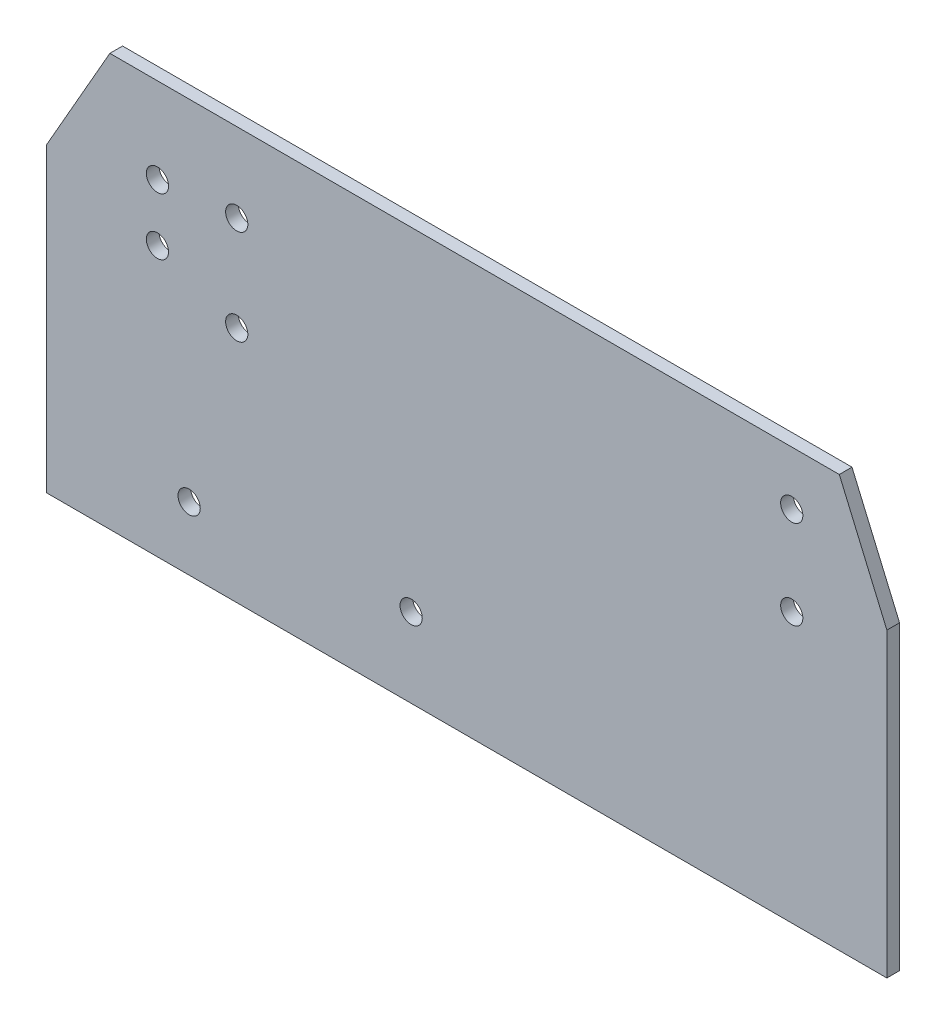
ISO-10303-21;
HEADER;
FILE_DESCRIPTION(('STEP AP214'),'2;1');
FILE_NAME('part.step','',(''),(''),'','','');
FILE_SCHEMA(('AUTOMOTIVE_DESIGN { 1 0 10303 214 1 1 1 1 }'));
ENDSEC;
DATA;
#1=APPLICATION_CONTEXT('core data for automotive mechanical design processes');
#2=APPLICATION_PROTOCOL_DEFINITION('international standard','automotive_design',2000,#1);
#3=PRODUCT_CONTEXT('',#1,'mechanical');
#4=PRODUCT('Part','Part','',(#3));
#5=PRODUCT_RELATED_PRODUCT_CATEGORY('part','',(#4));
#6=PRODUCT_DEFINITION_FORMATION('','',#4);
#7=PRODUCT_DEFINITION_CONTEXT('part definition',#1,'design');
#8=PRODUCT_DEFINITION('design','',#6,#7);
#9=PRODUCT_DEFINITION_SHAPE('','',#8);
#10=(LENGTH_UNIT() NAMED_UNIT(*) SI_UNIT(.MILLI.,.METRE.));
#11=(NAMED_UNIT(*) PLANE_ANGLE_UNIT() SI_UNIT($,.RADIAN.));
#12=(NAMED_UNIT(*) SI_UNIT($,.STERADIAN.) SOLID_ANGLE_UNIT());
#13=UNCERTAINTY_MEASURE_WITH_UNIT(LENGTH_MEASURE(1.E-05),#10,'distance_accuracy_value','');
#14=(GEOMETRIC_REPRESENTATION_CONTEXT(3) GLOBAL_UNCERTAINTY_ASSIGNED_CONTEXT((#13)) GLOBAL_UNIT_ASSIGNED_CONTEXT((#10,
#11,#12)) REPRESENTATION_CONTEXT('',''));
#15=CARTESIAN_POINT('',(0.,0.,0.));
#16=DIRECTION('',(0.,0.,1.));
#17=DIRECTION('',(1.,0.,0.));
#18=AXIS2_PLACEMENT_3D('',#15,#16,#17);
#19=CARTESIAN_POINT('',(0.,0.,2.));
#20=DIRECTION('',(0.,0.,1.));
#21=DIRECTION('',(1.,0.,0.));
#22=AXIS2_PLACEMENT_3D('',#19,#20,#21);
#23=PLANE('',#22);
#24=CARTESIAN_POINT('',(120.,88.,2.));
#25=DIRECTION('',(0.,0.,1.));
#26=DIRECTION('',(1.,0.,0.));
#27=AXIS2_PLACEMENT_3D('',#24,#25,#26);
#28=CIRCLE('',#27,3.50000000000001);
#29=CARTESIAN_POINT('',(123.5,88.,2.));
#30=VERTEX_POINT('',#29);
#31=EDGE_CURVE('E213',#30,#30,#28,.T.);
#32=ORIENTED_EDGE('',*,*,#31,.F.);
#33=EDGE_LOOP('',(#32));
#34=FACE_BOUND('',#33,.T.);
#35=CARTESIAN_POINT('',(-55.,50.,2.));
#36=DIRECTION('',(0.,0.,1.));
#37=DIRECTION('',(1.,0.,0.));
#38=AXIS2_PLACEMENT_3D('',#35,#36,#37);
#39=CIRCLE('',#38,3.5);
#40=CARTESIAN_POINT('',(-51.5,50.,2.));
#41=VERTEX_POINT('',#40);
#42=EDGE_CURVE('E223',#41,#41,#39,.T.);
#43=ORIENTED_EDGE('',*,*,#42,.F.);
#44=EDGE_LOOP('',(#43));
#45=FACE_BOUND('',#44,.T.);
#46=CARTESIAN_POINT('',(120.,60.,2.));
#47=DIRECTION('',(0.,0.,1.));
#48=DIRECTION('',(1.,0.,0.));
#49=AXIS2_PLACEMENT_3D('',#46,#47,#48);
#50=CIRCLE('',#49,3.50000000000001);
#51=CARTESIAN_POINT('',(123.5,60.,2.));
#52=VERTEX_POINT('',#51);
#53=EDGE_CURVE('E240',#52,#52,#50,.T.);
#54=ORIENTED_EDGE('',*,*,#53,.F.);
#55=EDGE_LOOP('',(#54));
#56=FACE_BOUND('',#55,.T.);
#57=CARTESIAN_POINT('',(0.,0.,2.));
#58=DIRECTION('',(0.,0.,1.));
#59=DIRECTION('',(1.,0.,0.));
#60=AXIS2_PLACEMENT_3D('',#57,#58,#59);
#61=CIRCLE('',#60,3.5);
#62=CARTESIAN_POINT('',(3.5,0.,2.));
#63=VERTEX_POINT('',#62);
#64=EDGE_CURVE('E128',#63,#63,#61,.T.);
#65=ORIENTED_EDGE('',*,*,#64,.F.);
#66=EDGE_LOOP('',(#65));
#67=FACE_BOUND('',#66,.T.);
#68=DIRECTION('',(0.,-1.,0.));
#69=VECTOR('',#68,1.);
#70=CARTESIAN_POINT('',(-115.,70.,2.));
#71=LINE('',#70,#69);
#72=CARTESIAN_POINT('',(-115.,70.,2.));
#73=VERTEX_POINT('',#72);
#74=CARTESIAN_POINT('',(-115.,-25.,2.));
#75=VERTEX_POINT('',#74);
#76=EDGE_CURVE('E140',#73,#75,#71,.T.);
#77=ORIENTED_EDGE('',*,*,#76,.T.);
#78=DIRECTION('',(1.,0.,0.));
#79=VECTOR('',#78,1.);
#80=CARTESIAN_POINT('',(-115.,-25.,2.));
#81=LINE('',#80,#79);
#82=CARTESIAN_POINT('',(150.,-25.,2.));
#83=VERTEX_POINT('',#82);
#84=EDGE_CURVE('E92',#75,#83,#81,.T.);
#85=ORIENTED_EDGE('',*,*,#84,.T.);
#86=DIRECTION('',(0.,1.,0.));
#87=VECTOR('',#86,1.);
#88=CARTESIAN_POINT('',(150.,-25.,2.));
#89=LINE('',#88,#87);
#90=CARTESIAN_POINT('',(150.,70.,2.));
#91=VERTEX_POINT('',#90);
#92=EDGE_CURVE('E107',#83,#91,#89,.T.);
#93=ORIENTED_EDGE('',*,*,#92,.T.);
#94=DIRECTION('',(-0.393919298579167,0.919145030018058,0.));
#95=VECTOR('',#94,1.);
#96=CARTESIAN_POINT('',(150.,70.,2.));
#97=LINE('',#96,#95);
#98=CARTESIAN_POINT('',(135.,105.,2.));
#99=VERTEX_POINT('',#98);
#100=EDGE_CURVE('E105',#91,#99,#97,.T.);
#101=ORIENTED_EDGE('',*,*,#100,.T.);
#102=DIRECTION('',(-1.,0.,0.));
#103=VECTOR('',#102,1.);
#104=CARTESIAN_POINT('',(135.,105.,2.));
#105=LINE('',#104,#103);
#106=CARTESIAN_POINT('',(-95.,105.,2.));
#107=VERTEX_POINT('',#106);
#108=EDGE_CURVE('E106',#99,#107,#105,.T.);
#109=ORIENTED_EDGE('',*,*,#108,.T.);
#110=DIRECTION('',(-0.496138938356834,-0.868243142124459,0.));
#111=VECTOR('',#110,1.);
#112=CARTESIAN_POINT('',(-95.,105.,2.));
#113=LINE('',#112,#111);
#114=EDGE_CURVE('E59',#107,#73,#113,.T.);
#115=ORIENTED_EDGE('',*,*,#114,.T.);
#116=EDGE_LOOP('',(#77,#85,#93,#101,#109,#115));
#117=FACE_BOUND('',#116,.T.);
#118=CARTESIAN_POINT('',(-80.,60.,2.));
#119=DIRECTION('',(0.,0.,1.));
#120=DIRECTION('',(1.,0.,0.));
#121=AXIS2_PLACEMENT_3D('',#118,#119,#120);
#122=CIRCLE('',#121,3.50000000000001);
#123=CARTESIAN_POINT('',(-76.5,60.,2.));
#124=VERTEX_POINT('',#123);
#125=EDGE_CURVE('E242',#124,#124,#122,.T.);
#126=ORIENTED_EDGE('',*,*,#125,.F.);
#127=EDGE_LOOP('',(#126));
#128=FACE_BOUND('',#127,.T.);
#129=CARTESIAN_POINT('',(-70.,-5.,2.));
#130=DIRECTION('',(0.,0.,1.));
#131=DIRECTION('',(1.,0.,0.));
#132=AXIS2_PLACEMENT_3D('',#129,#130,#131);
#133=CIRCLE('',#132,3.50000000000001);
#134=CARTESIAN_POINT('',(-66.5,-5.,2.));
#135=VERTEX_POINT('',#134);
#136=EDGE_CURVE('E232',#135,#135,#133,.T.);
#137=ORIENTED_EDGE('',*,*,#136,.F.);
#138=EDGE_LOOP('',(#137));
#139=FACE_BOUND('',#138,.T.);
#140=CARTESIAN_POINT('',(-55.,80.,2.));
#141=DIRECTION('',(0.,0.,1.));
#142=DIRECTION('',(1.,0.,0.));
#143=AXIS2_PLACEMENT_3D('',#140,#141,#142);
#144=CIRCLE('',#143,3.5);
#145=CARTESIAN_POINT('',(-51.5,80.,2.));
#146=VERTEX_POINT('',#145);
#147=EDGE_CURVE('E218',#146,#146,#144,.T.);
#148=ORIENTED_EDGE('',*,*,#147,.F.);
#149=EDGE_LOOP('',(#148));
#150=FACE_BOUND('',#149,.T.);
#151=CARTESIAN_POINT('',(-80.,78.,2.));
#152=DIRECTION('',(0.,0.,1.));
#153=DIRECTION('',(1.,0.,0.));
#154=AXIS2_PLACEMENT_3D('',#151,#152,#153);
#155=CIRCLE('',#154,3.50000000000001);
#156=CARTESIAN_POINT('',(-76.5,78.,2.));
#157=VERTEX_POINT('',#156);
#158=EDGE_CURVE('E204',#157,#157,#155,.T.);
#159=ORIENTED_EDGE('',*,*,#158,.F.);
#160=EDGE_LOOP('',(#159));
#161=FACE_BOUND('',#160,.T.);
#162=ADVANCED_FACE('F41',(#34,#45,#56,#67,#117,#128,#139,#150,#161),#23,.T.);
#163=CARTESIAN_POINT('',(0.,0.,-2.));
#164=DIRECTION('',(0.,0.,1.));
#165=DIRECTION('',(1.,0.,0.));
#166=AXIS2_PLACEMENT_3D('',#163,#164,#165);
#167=PLANE('',#166);
#168=DIRECTION('',(0.,-1.,0.));
#169=VECTOR('',#168,1.);
#170=CARTESIAN_POINT('',(-115.,70.,-2.));
#171=LINE('',#170,#169);
#172=CARTESIAN_POINT('',(-115.,70.,-2.));
#173=VERTEX_POINT('',#172);
#174=CARTESIAN_POINT('',(-115.,-25.,-2.));
#175=VERTEX_POINT('',#174);
#176=EDGE_CURVE('E127',#173,#175,#171,.T.);
#177=ORIENTED_EDGE('',*,*,#176,.F.);
#178=DIRECTION('',(-0.496138938356834,-0.868243142124459,0.));
#179=VECTOR('',#178,1.);
#180=CARTESIAN_POINT('',(-95.,105.,-2.));
#181=LINE('',#180,#179);
#182=CARTESIAN_POINT('',(-95.,105.,-2.));
#183=VERTEX_POINT('',#182);
#184=EDGE_CURVE('E87',#183,#173,#181,.T.);
#185=ORIENTED_EDGE('',*,*,#184,.F.);
#186=DIRECTION('',(-1.,0.,0.));
#187=VECTOR('',#186,1.);
#188=CARTESIAN_POINT('',(135.,105.,-2.));
#189=LINE('',#188,#187);
#190=CARTESIAN_POINT('',(135.,105.,-2.));
#191=VERTEX_POINT('',#190);
#192=EDGE_CURVE('E82',#191,#183,#189,.T.);
#193=ORIENTED_EDGE('',*,*,#192,.F.);
#194=DIRECTION('',(-0.393919298579167,0.919145030018058,0.));
#195=VECTOR('',#194,1.);
#196=CARTESIAN_POINT('',(150.,70.,-2.));
#197=LINE('',#196,#195);
#198=CARTESIAN_POINT('',(150.,70.,-2.));
#199=VERTEX_POINT('',#198);
#200=EDGE_CURVE('E118',#199,#191,#197,.T.);
#201=ORIENTED_EDGE('',*,*,#200,.F.);
#202=DIRECTION('',(0.,1.,0.));
#203=VECTOR('',#202,1.);
#204=CARTESIAN_POINT('',(150.,-25.,-2.));
#205=LINE('',#204,#203);
#206=CARTESIAN_POINT('',(150.,-25.,-2.));
#207=VERTEX_POINT('',#206);
#208=EDGE_CURVE('E134',#207,#199,#205,.T.);
#209=ORIENTED_EDGE('',*,*,#208,.F.);
#210=DIRECTION('',(1.,0.,0.));
#211=VECTOR('',#210,1.);
#212=CARTESIAN_POINT('',(-115.,-25.,-2.));
#213=LINE('',#212,#211);
#214=EDGE_CURVE('E129',#175,#207,#213,.T.);
#215=ORIENTED_EDGE('',*,*,#214,.F.);
#216=EDGE_LOOP('',(#177,#185,#193,#201,#209,#215));
#217=FACE_BOUND('',#216,.T.);
#218=CARTESIAN_POINT('',(0.,0.,-2.));
#219=DIRECTION('',(0.,0.,1.));
#220=DIRECTION('',(1.,0.,0.));
#221=AXIS2_PLACEMENT_3D('',#218,#219,#220);
#222=CIRCLE('',#221,3.5);
#223=CARTESIAN_POINT('',(3.5,0.,-2.));
#224=VERTEX_POINT('',#223);
#225=EDGE_CURVE('E247',#224,#224,#222,.T.);
#226=ORIENTED_EDGE('',*,*,#225,.T.);
#227=EDGE_LOOP('',(#226));
#228=FACE_BOUND('',#227,.T.);
#229=CARTESIAN_POINT('',(-80.,60.,-2.));
#230=DIRECTION('',(0.,0.,1.));
#231=DIRECTION('',(1.,0.,0.));
#232=AXIS2_PLACEMENT_3D('',#229,#230,#231);
#233=CIRCLE('',#232,3.50000000000001);
#234=CARTESIAN_POINT('',(-76.5,60.,-2.));
#235=VERTEX_POINT('',#234);
#236=EDGE_CURVE('E238',#235,#235,#233,.T.);
#237=ORIENTED_EDGE('',*,*,#236,.T.);
#238=EDGE_LOOP('',(#237));
#239=FACE_BOUND('',#238,.T.);
#240=CARTESIAN_POINT('',(120.,60.,-2.));
#241=DIRECTION('',(0.,0.,1.));
#242=DIRECTION('',(1.,0.,0.));
#243=AXIS2_PLACEMENT_3D('',#240,#241,#242);
#244=CIRCLE('',#243,3.50000000000001);
#245=CARTESIAN_POINT('',(123.5,60.,-2.));
#246=VERTEX_POINT('',#245);
#247=EDGE_CURVE('E231',#246,#246,#244,.T.);
#248=ORIENTED_EDGE('',*,*,#247,.T.);
#249=EDGE_LOOP('',(#248));
#250=FACE_BOUND('',#249,.T.);
#251=CARTESIAN_POINT('',(-70.,-5.,-2.));
#252=DIRECTION('',(0.,0.,1.));
#253=DIRECTION('',(1.,0.,0.));
#254=AXIS2_PLACEMENT_3D('',#251,#252,#253);
#255=CIRCLE('',#254,3.50000000000001);
#256=CARTESIAN_POINT('',(-66.5,-5.,-2.));
#257=VERTEX_POINT('',#256);
#258=EDGE_CURVE('E227',#257,#257,#255,.T.);
#259=ORIENTED_EDGE('',*,*,#258,.T.);
#260=EDGE_LOOP('',(#259));
#261=FACE_BOUND('',#260,.T.);
#262=CARTESIAN_POINT('',(-55.,50.,-2.));
#263=DIRECTION('',(0.,0.,1.));
#264=DIRECTION('',(1.,0.,0.));
#265=AXIS2_PLACEMENT_3D('',#262,#263,#264);
#266=CIRCLE('',#265,3.5);
#267=CARTESIAN_POINT('',(-51.5,50.,-2.));
#268=VERTEX_POINT('',#267);
#269=EDGE_CURVE('E225',#268,#268,#266,.T.);
#270=ORIENTED_EDGE('',*,*,#269,.T.);
#271=EDGE_LOOP('',(#270));
#272=FACE_BOUND('',#271,.T.);
#273=CARTESIAN_POINT('',(-55.,80.,-2.));
#274=DIRECTION('',(0.,0.,1.));
#275=DIRECTION('',(1.,0.,0.));
#276=AXIS2_PLACEMENT_3D('',#273,#274,#275);
#277=CIRCLE('',#276,3.5);
#278=CARTESIAN_POINT('',(-51.5,80.,-2.));
#279=VERTEX_POINT('',#278);
#280=EDGE_CURVE('E216',#279,#279,#277,.T.);
#281=ORIENTED_EDGE('',*,*,#280,.T.);
#282=EDGE_LOOP('',(#281));
#283=FACE_BOUND('',#282,.T.);
#284=CARTESIAN_POINT('',(120.,88.,-2.));
#285=DIRECTION('',(0.,0.,1.));
#286=DIRECTION('',(1.,0.,0.));
#287=AXIS2_PLACEMENT_3D('',#284,#285,#286);
#288=CIRCLE('',#287,3.50000000000001);
#289=CARTESIAN_POINT('',(123.5,88.,-2.));
#290=VERTEX_POINT('',#289);
#291=EDGE_CURVE('E209',#290,#290,#288,.T.);
#292=ORIENTED_EDGE('',*,*,#291,.T.);
#293=EDGE_LOOP('',(#292));
#294=FACE_BOUND('',#293,.T.);
#295=CARTESIAN_POINT('',(-80.,78.,-2.));
#296=DIRECTION('',(0.,0.,1.));
#297=DIRECTION('',(1.,0.,0.));
#298=AXIS2_PLACEMENT_3D('',#295,#296,#297);
#299=CIRCLE('',#298,3.50000000000001);
#300=CARTESIAN_POINT('',(-76.5,78.,-2.));
#301=VERTEX_POINT('',#300);
#302=EDGE_CURVE('E210',#301,#301,#299,.T.);
#303=ORIENTED_EDGE('',*,*,#302,.T.);
#304=EDGE_LOOP('',(#303));
#305=FACE_BOUND('',#304,.T.);
#306=ADVANCED_FACE('F148',(#217,#228,#239,#250,#261,#272,#283,#294,#305),#167,.F.);
#307=CARTESIAN_POINT('',(-115.,70.,2.));
#308=DIRECTION('',(1.,0.,0.));
#309=DIRECTION('',(0.,0.,-1.));
#310=AXIS2_PLACEMENT_3D('',#307,#308,#309);
#311=PLANE('',#310);
#312=ORIENTED_EDGE('',*,*,#176,.T.);
#313=DIRECTION('',(0.,0.,-1.));
#314=VECTOR('',#313,1.);
#315=CARTESIAN_POINT('',(-115.,-25.,2.));
#316=LINE('',#315,#314);
#317=EDGE_CURVE('E11',#75,#175,#316,.T.);
#318=ORIENTED_EDGE('',*,*,#317,.F.);
#319=ORIENTED_EDGE('',*,*,#76,.F.);
#320=DIRECTION('',(0.,0.,-1.));
#321=VECTOR('',#320,1.);
#322=CARTESIAN_POINT('',(-115.,70.,2.));
#323=LINE('',#322,#321);
#324=EDGE_CURVE('E125',#73,#173,#323,.T.);
#325=ORIENTED_EDGE('',*,*,#324,.T.);
#326=EDGE_LOOP('',(#312,#318,#319,#325));
#327=FACE_BOUND('',#326,.T.);
#328=ADVANCED_FACE('F43',(#327),#311,.F.);
#329=CARTESIAN_POINT('',(-115.,-25.,2.));
#330=DIRECTION('',(0.,1.,0.));
#331=DIRECTION('',(0.,0.,1.));
#332=AXIS2_PLACEMENT_3D('',#329,#330,#331);
#333=PLANE('',#332);
#334=ORIENTED_EDGE('',*,*,#214,.T.);
#335=DIRECTION('',(0.,0.,-1.));
#336=VECTOR('',#335,1.);
#337=CARTESIAN_POINT('',(150.,-25.,2.));
#338=LINE('',#337,#336);
#339=EDGE_CURVE('E49',#83,#207,#338,.T.);
#340=ORIENTED_EDGE('',*,*,#339,.F.);
#341=ORIENTED_EDGE('',*,*,#84,.F.);
#342=ORIENTED_EDGE('',*,*,#317,.T.);
#343=EDGE_LOOP('',(#334,#340,#341,#342));
#344=FACE_BOUND('',#343,.T.);
#345=ADVANCED_FACE('F346',(#344),#333,.F.);
#346=CARTESIAN_POINT('',(150.,-25.,2.));
#347=DIRECTION('',(-1.,0.,0.));
#348=DIRECTION('',(0.,0.,1.));
#349=AXIS2_PLACEMENT_3D('',#346,#347,#348);
#350=PLANE('',#349);
#351=ORIENTED_EDGE('',*,*,#208,.T.);
#352=DIRECTION('',(0.,0.,-1.));
#353=VECTOR('',#352,1.);
#354=CARTESIAN_POINT('',(150.,70.,2.));
#355=LINE('',#354,#353);
#356=EDGE_CURVE('E119',#91,#199,#355,.T.);
#357=ORIENTED_EDGE('',*,*,#356,.F.);
#358=ORIENTED_EDGE('',*,*,#92,.F.);
#359=ORIENTED_EDGE('',*,*,#339,.T.);
#360=EDGE_LOOP('',(#351,#357,#358,#359));
#361=FACE_BOUND('',#360,.T.);
#362=ADVANCED_FACE('F141',(#361),#350,.F.);
#363=CARTESIAN_POINT('',(150.,70.,2.));
#364=DIRECTION('',(-0.919145030018058,-0.393919298579167,0.));
#365=DIRECTION('',(0.393919298579168,-0.919145030018058,0.));
#366=AXIS2_PLACEMENT_3D('',#363,#364,#365);
#367=PLANE('',#366);
#368=ORIENTED_EDGE('',*,*,#200,.T.);
#369=DIRECTION('',(0.,0.,-1.));
#370=VECTOR('',#369,1.);
#371=CARTESIAN_POINT('',(135.,105.,2.));
#372=LINE('',#371,#370);
#373=EDGE_CURVE('E114',#99,#191,#372,.T.);
#374=ORIENTED_EDGE('',*,*,#373,.F.);
#375=ORIENTED_EDGE('',*,*,#100,.F.);
#376=ORIENTED_EDGE('',*,*,#356,.T.);
#377=EDGE_LOOP('',(#368,#374,#375,#376));
#378=FACE_BOUND('',#377,.T.);
#379=ADVANCED_FACE('F111',(#378),#367,.F.);
#380=CARTESIAN_POINT('',(135.,105.,2.));
#381=DIRECTION('',(0.,-1.,0.));
#382=DIRECTION('',(0.,0.,-1.));
#383=AXIS2_PLACEMENT_3D('',#380,#381,#382);
#384=PLANE('',#383);
#385=ORIENTED_EDGE('',*,*,#192,.T.);
#386=DIRECTION('',(0.,0.,-1.));
#387=VECTOR('',#386,1.);
#388=CARTESIAN_POINT('',(-95.,105.,2.));
#389=LINE('',#388,#387);
#390=EDGE_CURVE('E117',#107,#183,#389,.T.);
#391=ORIENTED_EDGE('',*,*,#390,.F.);
#392=ORIENTED_EDGE('',*,*,#108,.F.);
#393=ORIENTED_EDGE('',*,*,#373,.T.);
#394=EDGE_LOOP('',(#385,#391,#392,#393));
#395=FACE_BOUND('',#394,.T.);
#396=ADVANCED_FACE('F116',(#395),#384,.F.);
#397=CARTESIAN_POINT('',(-95.,105.,2.));
#398=DIRECTION('',(0.868243142124459,-0.496138938356834,0.));
#399=DIRECTION('',(0.496138938356834,0.868243142124459,0.));
#400=AXIS2_PLACEMENT_3D('',#397,#398,#399);
#401=PLANE('',#400);
#402=ORIENTED_EDGE('',*,*,#184,.T.);
#403=ORIENTED_EDGE('',*,*,#324,.F.);
#404=ORIENTED_EDGE('',*,*,#114,.F.);
#405=ORIENTED_EDGE('',*,*,#390,.T.);
#406=EDGE_LOOP('',(#402,#403,#404,#405));
#407=FACE_BOUND('',#406,.T.);
#408=ADVANCED_FACE('F151',(#407),#401,.F.);
#409=CARTESIAN_POINT('',(0.,0.,2.));
#410=DIRECTION('',(0.,0.,-1.));
#411=DIRECTION('',(-1.,0.,0.));
#412=AXIS2_PLACEMENT_3D('',#409,#410,#411);
#413=CYLINDRICAL_SURFACE('',#412,3.5);
#414=ORIENTED_EDGE('',*,*,#64,.T.);
#415=EDGE_LOOP('',(#414));
#416=FACE_BOUND('',#415,.T.);
#417=ORIENTED_EDGE('',*,*,#225,.F.);
#418=EDGE_LOOP('',(#417));
#419=FACE_BOUND('',#418,.T.);
#420=ADVANCED_FACE('F153',(#416,#419),#413,.F.);
#421=CARTESIAN_POINT('',(-80.,60.,2.));
#422=DIRECTION('',(0.,0.,-1.));
#423=DIRECTION('',(-1.,0.,0.));
#424=AXIS2_PLACEMENT_3D('',#421,#422,#423);
#425=CYLINDRICAL_SURFACE('',#424,3.50000000000001);
#426=ORIENTED_EDGE('',*,*,#125,.T.);
#427=EDGE_LOOP('',(#426));
#428=FACE_BOUND('',#427,.T.);
#429=ORIENTED_EDGE('',*,*,#236,.F.);
#430=EDGE_LOOP('',(#429));
#431=FACE_BOUND('',#430,.T.);
#432=ADVANCED_FACE('F157',(#428,#431),#425,.F.);
#433=CARTESIAN_POINT('',(120.,60.,2.));
#434=DIRECTION('',(0.,0.,-1.));
#435=DIRECTION('',(-1.,0.,0.));
#436=AXIS2_PLACEMENT_3D('',#433,#434,#435);
#437=CYLINDRICAL_SURFACE('',#436,3.50000000000001);
#438=ORIENTED_EDGE('',*,*,#53,.T.);
#439=EDGE_LOOP('',(#438));
#440=FACE_BOUND('',#439,.T.);
#441=ORIENTED_EDGE('',*,*,#247,.F.);
#442=EDGE_LOOP('',(#441));
#443=FACE_BOUND('',#442,.T.);
#444=ADVANCED_FACE('F171',(#440,#443),#437,.F.);
#445=CARTESIAN_POINT('',(-70.,-5.,2.));
#446=DIRECTION('',(0.,0.,-1.));
#447=DIRECTION('',(-1.,0.,0.));
#448=AXIS2_PLACEMENT_3D('',#445,#446,#447);
#449=CYLINDRICAL_SURFACE('',#448,3.50000000000001);
#450=ORIENTED_EDGE('',*,*,#136,.T.);
#451=EDGE_LOOP('',(#450));
#452=FACE_BOUND('',#451,.T.);
#453=ORIENTED_EDGE('',*,*,#258,.F.);
#454=EDGE_LOOP('',(#453));
#455=FACE_BOUND('',#454,.T.);
#456=ADVANCED_FACE('F176',(#452,#455),#449,.F.);
#457=CARTESIAN_POINT('',(-55.,50.,2.));
#458=DIRECTION('',(0.,0.,-1.));
#459=DIRECTION('',(-1.,0.,0.));
#460=AXIS2_PLACEMENT_3D('',#457,#458,#459);
#461=CYLINDRICAL_SURFACE('',#460,3.5);
#462=ORIENTED_EDGE('',*,*,#42,.T.);
#463=EDGE_LOOP('',(#462));
#464=FACE_BOUND('',#463,.T.);
#465=ORIENTED_EDGE('',*,*,#269,.F.);
#466=EDGE_LOOP('',(#465));
#467=FACE_BOUND('',#466,.T.);
#468=ADVANCED_FACE('F181',(#464,#467),#461,.F.);
#469=CARTESIAN_POINT('',(-55.,80.,2.));
#470=DIRECTION('',(0.,0.,-1.));
#471=DIRECTION('',(-1.,0.,0.));
#472=AXIS2_PLACEMENT_3D('',#469,#470,#471);
#473=CYLINDRICAL_SURFACE('',#472,3.5);
#474=ORIENTED_EDGE('',*,*,#147,.T.);
#475=EDGE_LOOP('',(#474));
#476=FACE_BOUND('',#475,.T.);
#477=ORIENTED_EDGE('',*,*,#280,.F.);
#478=EDGE_LOOP('',(#477));
#479=FACE_BOUND('',#478,.T.);
#480=ADVANCED_FACE('F189',(#476,#479),#473,.F.);
#481=CARTESIAN_POINT('',(120.,88.,2.));
#482=DIRECTION('',(0.,0.,-1.));
#483=DIRECTION('',(-1.,0.,0.));
#484=AXIS2_PLACEMENT_3D('',#481,#482,#483);
#485=CYLINDRICAL_SURFACE('',#484,3.50000000000001);
#486=ORIENTED_EDGE('',*,*,#31,.T.);
#487=EDGE_LOOP('',(#486));
#488=FACE_BOUND('',#487,.T.);
#489=ORIENTED_EDGE('',*,*,#291,.F.);
#490=EDGE_LOOP('',(#489));
#491=FACE_BOUND('',#490,.T.);
#492=ADVANCED_FACE('F192',(#488,#491),#485,.F.);
#493=CARTESIAN_POINT('',(-80.,78.,2.));
#494=DIRECTION('',(0.,0.,-1.));
#495=DIRECTION('',(-1.,0.,0.));
#496=AXIS2_PLACEMENT_3D('',#493,#494,#495);
#497=CYLINDRICAL_SURFACE('',#496,3.50000000000001);
#498=ORIENTED_EDGE('',*,*,#158,.T.);
#499=EDGE_LOOP('',(#498));
#500=FACE_BOUND('',#499,.T.);
#501=ORIENTED_EDGE('',*,*,#302,.F.);
#502=EDGE_LOOP('',(#501));
#503=FACE_BOUND('',#502,.T.);
#504=ADVANCED_FACE('F193',(#500,#503),#497,.F.);
#505=CLOSED_SHELL('',(#162,#306,#328,#345,#362,#379,#396,#408,#420,#432,#444,#456,#468,#480,
#492,#504));
#506=MANIFOLD_SOLID_BREP('B2',#505);
#507=ADVANCED_BREP_SHAPE_REPRESENTATION('',(#18,#506),#14);
#508=SHAPE_DEFINITION_REPRESENTATION(#9,#507);
ENDSEC;
END-ISO-10303-21;
